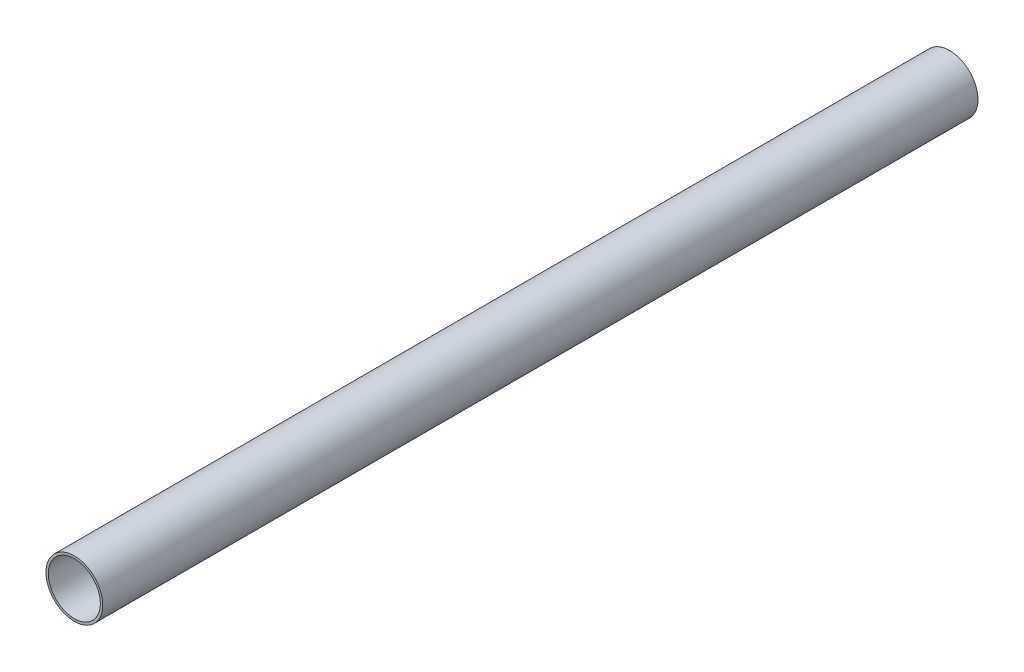
ISO-10303-21;
HEADER;
FILE_DESCRIPTION(('STEP AP214'),'2;1');
FILE_NAME('part.step','',(''),(''),'','','');
FILE_SCHEMA(('AUTOMOTIVE_DESIGN { 1 0 10303 214 1 1 1 1 }'));
ENDSEC;
DATA;
#1=APPLICATION_CONTEXT('core data for automotive mechanical design processes');
#2=APPLICATION_PROTOCOL_DEFINITION('international standard','automotive_design',2000,#1);
#3=PRODUCT_CONTEXT('',#1,'mechanical');
#4=PRODUCT('Part','Part','',(#3));
#5=PRODUCT_RELATED_PRODUCT_CATEGORY('part','',(#4));
#6=PRODUCT_DEFINITION_FORMATION('','',#4);
#7=PRODUCT_DEFINITION_CONTEXT('part definition',#1,'design');
#8=PRODUCT_DEFINITION('design','',#6,#7);
#9=PRODUCT_DEFINITION_SHAPE('','',#8);
#10=(LENGTH_UNIT() NAMED_UNIT(*) SI_UNIT(.MILLI.,.METRE.));
#11=(NAMED_UNIT(*) PLANE_ANGLE_UNIT() SI_UNIT($,.RADIAN.));
#12=(NAMED_UNIT(*) SI_UNIT($,.STERADIAN.) SOLID_ANGLE_UNIT());
#13=UNCERTAINTY_MEASURE_WITH_UNIT(LENGTH_MEASURE(1.E-05),#10,'distance_accuracy_value','');
#14=(GEOMETRIC_REPRESENTATION_CONTEXT(3) GLOBAL_UNCERTAINTY_ASSIGNED_CONTEXT((#13)) GLOBAL_UNIT_ASSIGNED_CONTEXT((#10,
#11,#12)) REPRESENTATION_CONTEXT('',''));
#15=CARTESIAN_POINT('',(0.,0.,0.));
#16=DIRECTION('',(0.,0.,1.));
#17=DIRECTION('',(1.,0.,0.));
#18=AXIS2_PLACEMENT_3D('',#15,#16,#17);
#19=CARTESIAN_POINT('',(0.,0.,370.));
#20=DIRECTION('',(0.,0.,1.));
#21=DIRECTION('',(1.,0.,0.));
#22=AXIS2_PLACEMENT_3D('',#19,#20,#21);
#23=PLANE('',#22);
#24=CARTESIAN_POINT('',(0.,0.,370.));
#25=DIRECTION('',(0.,0.,1.));
#26=DIRECTION('',(1.,0.,0.));
#27=AXIS2_PLACEMENT_3D('',#24,#25,#26);
#28=CIRCLE('',#27,12.);
#29=CARTESIAN_POINT('',(12.,0.,370.));
#30=VERTEX_POINT('',#29);
#31=EDGE_CURVE('E10',#30,#30,#28,.T.);
#32=ORIENTED_EDGE('',*,*,#31,.T.);
#33=EDGE_LOOP('',(#32));
#34=FACE_BOUND('',#33,.T.);
#35=CARTESIAN_POINT('',(0.,0.,370.));
#36=DIRECTION('',(0.,0.,1.));
#37=DIRECTION('',(1.,0.,0.));
#38=AXIS2_PLACEMENT_3D('',#35,#36,#37);
#39=CIRCLE('',#38,11.);
#40=CARTESIAN_POINT('',(11.,0.,370.));
#41=VERTEX_POINT('',#40);
#42=EDGE_CURVE('E45',#41,#41,#39,.T.);
#43=ORIENTED_EDGE('',*,*,#42,.F.);
#44=EDGE_LOOP('',(#43));
#45=FACE_BOUND('',#44,.T.);
#46=ADVANCED_FACE('F34',(#34,#45),#23,.T.);
#47=CARTESIAN_POINT('',(0.,0.,0.));
#48=DIRECTION('',(0.,0.,1.));
#49=DIRECTION('',(1.,0.,0.));
#50=AXIS2_PLACEMENT_3D('',#47,#48,#49);
#51=PLANE('',#50);
#52=CARTESIAN_POINT('',(0.,0.,0.));
#53=DIRECTION('',(0.,0.,1.));
#54=DIRECTION('',(1.,0.,0.));
#55=AXIS2_PLACEMENT_3D('',#52,#53,#54);
#56=CIRCLE('',#55,12.);
#57=CARTESIAN_POINT('',(12.,0.,0.));
#58=VERTEX_POINT('',#57);
#59=EDGE_CURVE('E38',#58,#58,#56,.T.);
#60=ORIENTED_EDGE('',*,*,#59,.F.);
#61=EDGE_LOOP('',(#60));
#62=FACE_BOUND('',#61,.T.);
#63=CARTESIAN_POINT('',(0.,0.,0.));
#64=DIRECTION('',(0.,0.,1.));
#65=DIRECTION('',(1.,0.,0.));
#66=AXIS2_PLACEMENT_3D('',#63,#64,#65);
#67=CIRCLE('',#66,11.);
#68=CARTESIAN_POINT('',(11.,0.,0.));
#69=VERTEX_POINT('',#68);
#70=EDGE_CURVE('E47',#69,#69,#67,.T.);
#71=ORIENTED_EDGE('',*,*,#70,.T.);
#72=EDGE_LOOP('',(#71));
#73=FACE_BOUND('',#72,.T.);
#74=ADVANCED_FACE('F57',(#62,#73),#51,.F.);
#75=CARTESIAN_POINT('',(0.,0.,370.));
#76=DIRECTION('',(0.,0.,-1.));
#77=DIRECTION('',(-1.,0.,0.));
#78=AXIS2_PLACEMENT_3D('',#75,#76,#77);
#79=CYLINDRICAL_SURFACE('',#78,12.);
#80=ORIENTED_EDGE('',*,*,#31,.F.);
#81=EDGE_LOOP('',(#80));
#82=FACE_BOUND('',#81,.T.);
#83=ORIENTED_EDGE('',*,*,#59,.T.);
#84=EDGE_LOOP('',(#83));
#85=FACE_BOUND('',#84,.T.);
#86=ADVANCED_FACE('F36',(#82,#85),#79,.T.);
#87=CARTESIAN_POINT('',(0.,0.,370.));
#88=DIRECTION('',(0.,0.,-1.));
#89=DIRECTION('',(-1.,0.,0.));
#90=AXIS2_PLACEMENT_3D('',#87,#88,#89);
#91=CYLINDRICAL_SURFACE('',#90,11.);
#92=ORIENTED_EDGE('',*,*,#42,.T.);
#93=EDGE_LOOP('',(#92));
#94=FACE_BOUND('',#93,.T.);
#95=ORIENTED_EDGE('',*,*,#70,.F.);
#96=EDGE_LOOP('',(#95));
#97=FACE_BOUND('',#96,.T.);
#98=ADVANCED_FACE('F53',(#94,#97),#91,.F.);
#99=CLOSED_SHELL('',(#46,#74,#86,#98));
#100=MANIFOLD_SOLID_BREP('B2',#99);
#101=ADVANCED_BREP_SHAPE_REPRESENTATION('',(#18,#100),#14);
#102=SHAPE_DEFINITION_REPRESENTATION(#9,#101);
ENDSEC;
END-ISO-10303-21;
